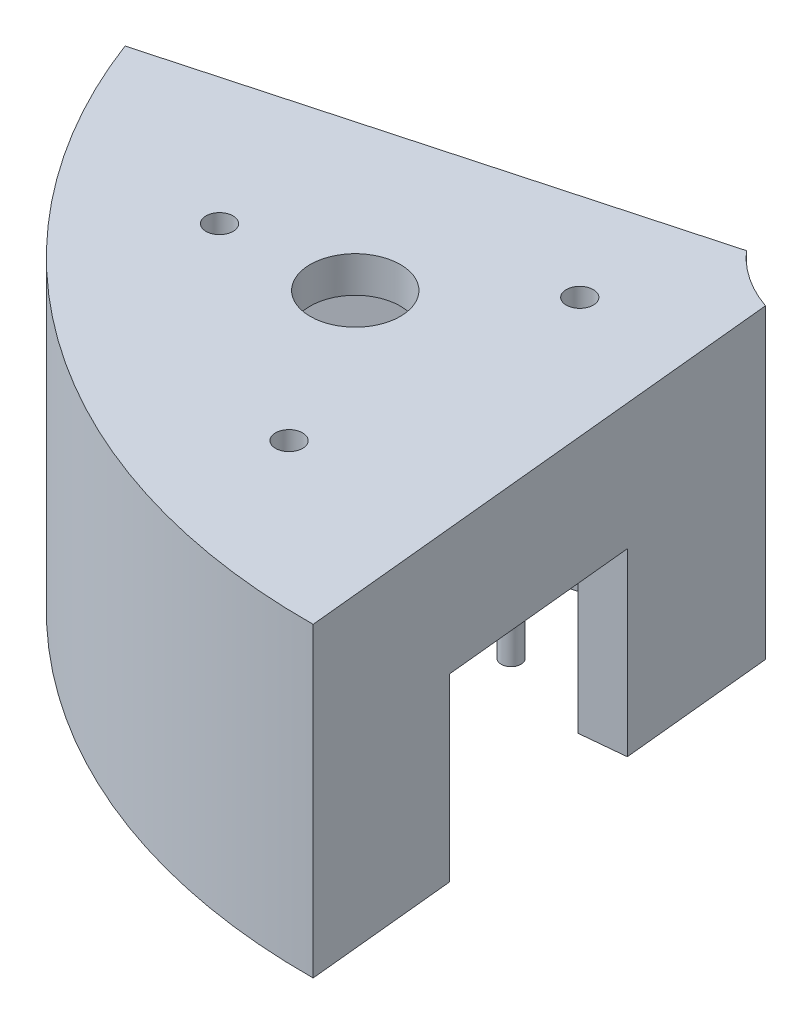
ISO-10303-21;
HEADER;
FILE_DESCRIPTION(('STEP AP214'),'2;1');
FILE_NAME('part.step','',(''),(''),'','','');
FILE_SCHEMA(('AUTOMOTIVE_DESIGN { 1 0 10303 214 1 1 1 1 }'));
ENDSEC;
DATA;
#1=APPLICATION_CONTEXT('core data for automotive mechanical design processes');
#2=APPLICATION_PROTOCOL_DEFINITION('international standard','automotive_design',2000,#1);
#3=PRODUCT_CONTEXT('',#1,'mechanical');
#4=PRODUCT('Part','Part','',(#3));
#5=PRODUCT_RELATED_PRODUCT_CATEGORY('part','',(#4));
#6=PRODUCT_DEFINITION_FORMATION('','',#4);
#7=PRODUCT_DEFINITION_CONTEXT('part definition',#1,'design');
#8=PRODUCT_DEFINITION('design','',#6,#7);
#9=PRODUCT_DEFINITION_SHAPE('','',#8);
#10=(LENGTH_UNIT() NAMED_UNIT(*) SI_UNIT(.MILLI.,.METRE.));
#11=(NAMED_UNIT(*) PLANE_ANGLE_UNIT() SI_UNIT($,.RADIAN.));
#12=(NAMED_UNIT(*) SI_UNIT($,.STERADIAN.) SOLID_ANGLE_UNIT());
#13=UNCERTAINTY_MEASURE_WITH_UNIT(LENGTH_MEASURE(1.E-05),#10,'distance_accuracy_value','');
#14=(GEOMETRIC_REPRESENTATION_CONTEXT(3) GLOBAL_UNCERTAINTY_ASSIGNED_CONTEXT((#13)) GLOBAL_UNIT_ASSIGNED_CONTEXT((#10,
#11,#12)) REPRESENTATION_CONTEXT('',''));
#15=CARTESIAN_POINT('',(0.,0.,0.));
#16=DIRECTION('',(0.,0.,1.));
#17=DIRECTION('',(1.,0.,0.));
#18=AXIS2_PLACEMENT_3D('',#15,#16,#17);
#19=CARTESIAN_POINT('',(-7.71564874168124,30.,0.68961613389634));
#20=DIRECTION('',(0.,-1.,0.));
#21=DIRECTION('',(0.,0.,-1.));
#22=AXIS2_PLACEMENT_3D('',#19,#20,#21);
#23=PLANE('',#22);
#24=CARTESIAN_POINT('',(-39.8044226076985,30.,40.1866372368154));
#25=DIRECTION('',(0.,-1.,0.));
#26=DIRECTION('',(0.,0.,-1.));
#27=AXIS2_PLACEMENT_3D('',#24,#25,#26);
#28=CIRCLE('',#27,5.);
#29=CARTESIAN_POINT('',(-39.8044226076985,30.,35.1866372368154));
#30=VERTEX_POINT('',#29);
#31=EDGE_CURVE('E320',#30,#30,#28,.T.);
#32=ORIENTED_EDGE('',*,*,#31,.F.);
#33=EDGE_LOOP('',(#32));
#34=FACE_BOUND('',#33,.T.);
#35=CARTESIAN_POINT('',(-53.760144922016,30.,41.2992084415757));
#36=DIRECTION('',(0.,-1.,0.));
#37=DIRECTION('',(0.,0.,-1.));
#38=AXIS2_PLACEMENT_3D('',#35,#36,#37);
#39=CIRCLE('',#38,1.5);
#40=CARTESIAN_POINT('',(-53.760144922016,30.,39.7992084415757));
#41=VERTEX_POINT('',#40);
#42=EDGE_CURVE('E311',#41,#41,#39,.T.);
#43=ORIENTED_EDGE('',*,*,#42,.F.);
#44=EDGE_LOOP('',(#43));
#45=FACE_BOUND('',#44,.T.);
#46=CARTESIAN_POINT('',(-29.0414322100276,30.,58.2987743731572));
#47=DIRECTION('',(0.,-1.,0.));
#48=DIRECTION('',(0.,0.,-1.));
#49=AXIS2_PLACEMENT_3D('',#46,#47,#48);
#50=CIRCLE('',#49,1.5);
#51=CARTESIAN_POINT('',(-29.0414322100276,30.,56.7987743731572));
#52=VERTEX_POINT('',#51);
#53=EDGE_CURVE('E316',#52,#52,#50,.T.);
#54=ORIENTED_EDGE('',*,*,#53,.F.);
#55=EDGE_LOOP('',(#54));
#56=FACE_BOUND('',#55,.T.);
#57=CARTESIAN_POINT('',(-26.6787326159637,30.,28.3919582499352));
#58=DIRECTION('',(0.,-1.,0.));
#59=DIRECTION('',(0.,0.,-1.));
#60=AXIS2_PLACEMENT_3D('',#57,#58,#59);
#61=CIRCLE('',#60,1.5);
#62=CARTESIAN_POINT('',(-26.6787326159637,30.,26.8919582499352));
#63=VERTEX_POINT('',#62);
#64=EDGE_CURVE('E310',#63,#63,#61,.T.);
#65=ORIENTED_EDGE('',*,*,#64,.F.);
#66=EDGE_LOOP('',(#65));
#67=FACE_BOUND('',#66,.T.);
#68=DIRECTION('',(-0.963914080377249,0.,0.266213533935604));
#69=VECTOR('',#68,1.);
#70=CARTESIAN_POINT('',(-35.1514498430067,30.,30.7432378051372));
#71=LINE('',#70,#69);
#72=CARTESIAN_POINT('',(-35.1514498430067,30.,30.7432378051372));
#73=VERTEX_POINT('',#72);
#74=CARTESIAN_POINT('',(-56.3576215387011,30.,36.5999526548119));
#75=VERTEX_POINT('',#74);
#76=EDGE_CURVE('E55',#73,#75,#71,.T.);
#77=ORIENTED_EDGE('',*,*,#76,.F.);
#78=DIRECTION('',(0.266213533935604,0.,0.963914080377249));
#79=VECTOR('',#78,1.);
#80=CARTESIAN_POINT('',(-37.0149445805559,30.,23.9958392424964));
#81=LINE('',#80,#79);
#82=CARTESIAN_POINT('',(-37.0149445805559,30.,23.9958392424964));
#83=VERTEX_POINT('',#82);
#84=EDGE_CURVE('E212',#83,#73,#81,.T.);
#85=ORIENTED_EDGE('',*,*,#84,.F.);
#86=DIRECTION('',(0.963914080377249,0.,-0.266213533935604));
#87=VECTOR('',#86,1.);
#88=CARTESIAN_POINT('',(-24.1918740905534,30.,20.4543670505839));
#89=LINE('',#88,#87);
#90=CARTESIAN_POINT('',(-24.1918740905534,30.,20.4543670505839));
#91=VERTEX_POINT('',#90);
#92=EDGE_CURVE('E343',#83,#91,#89,.T.);
#93=ORIENTED_EDGE('',*,*,#92,.T.);
#94=CARTESIAN_POINT('',(-12.1841150520235,30.,9.47882797219441));
#95=DIRECTION('',(0.,1.,0.));
#96=DIRECTION('',(0.,0.,-1.));
#97=AXIS2_PLACEMENT_3D('',#94,#95,#96);
#98=CIRCLE('',#97,16.2680280055283);
#99=CARTESIAN_POINT('',(-20.1104082102706,30.,23.685256515575));
#100=VERTEX_POINT('',#99);
#101=EDGE_CURVE('E348',#91,#100,#98,.T.);
#102=ORIENTED_EDGE('',*,*,#101,.T.);
#103=DIRECTION('',(0.0960885190155767,0.,0.995372792733151));
#104=VECTOR('',#103,1.);
#105=CARTESIAN_POINT('',(-15.6160084731713,30.,70.2423609834927));
#106=LINE('',#105,#104);
#107=CARTESIAN_POINT('',(-18.8830181197009,30.,36.3996860305656));
#108=VERTEX_POINT('',#107);
#109=EDGE_CURVE('E353',#100,#108,#106,.T.);
#110=ORIENTED_EDGE('',*,*,#109,.T.);
#111=DIRECTION('',(0.995372792733151,0.,-0.0960885190155766));
#112=VECTOR('',#111,1.);
#113=CARTESIAN_POINT('',(-18.8830181197009,30.,36.3996860305656));
#114=LINE('',#113,#112);
#115=CARTESIAN_POINT('',(-25.850627668833,30.,37.0723056636746));
#116=VERTEX_POINT('',#115);
#117=EDGE_CURVE('E214',#116,#108,#114,.T.);
#118=ORIENTED_EDGE('',*,*,#117,.F.);
#119=DIRECTION('',(-0.0960885190155769,0.,-0.995372792733151));
#120=VECTOR('',#119,1.);
#121=CARTESIAN_POINT('',(-25.850627668833,30.,37.0723056636746));
#122=LINE('',#121,#120);
#123=CARTESIAN_POINT('',(-23.7366802504903,30.,58.9705071038039));
#124=VERTEX_POINT('',#123);
#125=EDGE_CURVE('E229',#124,#116,#122,.T.);
#126=ORIENTED_EDGE('',*,*,#125,.F.);
#127=DIRECTION('',(-0.995372792733151,0.,0.0960885190155767));
#128=VECTOR('',#127,1.);
#129=CARTESIAN_POINT('',(-16.7690707013582,30.,58.2978874706949));
#130=LINE('',#129,#128);
#131=CARTESIAN_POINT('',(-16.7690707013582,30.,58.2978874706949));
#132=VERTEX_POINT('',#131);
#133=EDGE_CURVE('E218',#132,#124,#130,.T.);
#134=ORIENTED_EDGE('',*,*,#133,.F.);
#135=CARTESIAN_POINT('',(-15.6160084731713,30.,70.2423609834927));
#136=VERTEX_POINT('',#135);
#137=EDGE_CURVE('E352',#132,#136,#106,.T.);
#138=ORIENTED_EDGE('',*,*,#137,.T.);
#139=CARTESIAN_POINT('',(-7.71564874168124,30.,0.68961613389634));
#140=DIRECTION('',(0.,-1.,0.));
#141=DIRECTION('',(0.,0.,-1.));
#142=AXIS2_PLACEMENT_3D('',#139,#140,#141);
#143=CIRCLE('',#142,70.);
#144=CARTESIAN_POINT('',(-69.7881190193564,30.,33.0471258283574));
#145=VERTEX_POINT('',#144);
#146=EDGE_CURVE('E339',#136,#145,#143,.T.);
#147=ORIENTED_EDGE('',*,*,#146,.T.);
#148=CARTESIAN_POINT('',(-58.2211162762503,30.,29.8525540921712));
#149=VERTEX_POINT('',#148);
#150=EDGE_CURVE('E345',#145,#149,#89,.T.);
#151=ORIENTED_EDGE('',*,*,#150,.T.);
#152=DIRECTION('',(-0.266213533935604,0.,-0.963914080377249));
#153=VECTOR('',#152,1.);
#154=CARTESIAN_POINT('',(-58.2211162762503,30.,29.8525540921712));
#155=LINE('',#154,#153);
#156=EDGE_CURVE('E60',#75,#149,#155,.T.);
#157=ORIENTED_EDGE('',*,*,#156,.F.);
#158=EDGE_LOOP('',(#77,#85,#93,#102,#110,#118,#126,#134,#138,#147,#151,#157));
#159=FACE_BOUND('',#158,.T.);
#160=ADVANCED_FACE('F39',(#34,#45,#56,#67,#159),#23,.T.);
#161=CARTESIAN_POINT('',(-24.1918740905534,30.,20.4543670505839));
#162=DIRECTION('',(-0.266213533935604,0.,-0.963914080377249));
#163=DIRECTION('',(-0.963914080377249,0.,0.266213533935604));
#164=AXIS2_PLACEMENT_3D('',#161,#162,#163);
#165=PLANE('',#164);
#166=DIRECTION('',(0.,1.,0.));
#167=VECTOR('',#166,1.);
#168=CARTESIAN_POINT('',(-37.0149445805559,20.,23.9958392424964));
#169=LINE('',#168,#167);
#170=CARTESIAN_POINT('',(-37.0149445805559,20.,23.9958392424964));
#171=VERTEX_POINT('',#170);
#172=EDGE_CURVE('E777',#171,#83,#169,.T.);
#173=ORIENTED_EDGE('',*,*,#172,.F.);
#174=DIRECTION('',(0.,-1.,0.));
#175=VECTOR('',#174,1.);
#176=CARTESIAN_POINT('',(-37.0149445805559,30.,23.9958392424964));
#177=LINE('',#176,#175);
#178=CARTESIAN_POINT('',(-37.0149445805559,0.,23.9958392424964));
#179=VERTEX_POINT('',#178);
#180=EDGE_CURVE('E441',#171,#179,#177,.T.);
#181=ORIENTED_EDGE('',*,*,#180,.T.);
#182=DIRECTION('',(0.963914080377249,0.,-0.266213533935604));
#183=VECTOR('',#182,1.);
#184=CARTESIAN_POINT('',(-24.1918740905534,0.,20.4543670505839));
#185=LINE('',#184,#183);
#186=CARTESIAN_POINT('',(-24.1918740905534,0.,20.4543670505839));
#187=VERTEX_POINT('',#186);
#188=EDGE_CURVE('E361',#179,#187,#185,.T.);
#189=ORIENTED_EDGE('',*,*,#188,.T.);
#190=DIRECTION('',(0.,-1.,0.));
#191=VECTOR('',#190,1.);
#192=CARTESIAN_POINT('',(-24.1918740905534,30.,20.4543670505839));
#193=LINE('',#192,#191);
#194=EDGE_CURVE('E382',#91,#187,#193,.T.);
#195=ORIENTED_EDGE('',*,*,#194,.F.);
#196=ORIENTED_EDGE('',*,*,#92,.F.);
#197=EDGE_LOOP('',(#173,#181,#189,#195,#196));
#198=FACE_BOUND('',#197,.T.);
#199=ADVANCED_FACE('F534',(#198),#165,.F.);
#200=DIRECTION('',(0.,1.,0.));
#201=VECTOR('',#200,1.);
#202=CARTESIAN_POINT('',(-58.2211162762503,20.,29.8525540921712));
#203=LINE('',#202,#201);
#204=CARTESIAN_POINT('',(-58.2211162762503,20.,29.8525540921711));
#205=VERTEX_POINT('',#204);
#206=EDGE_CURVE('E220',#205,#149,#203,.T.);
#207=ORIENTED_EDGE('',*,*,#206,.T.);
#208=ORIENTED_EDGE('',*,*,#150,.F.);
#209=DIRECTION('',(0.,-1.,0.));
#210=VECTOR('',#209,1.);
#211=CARTESIAN_POINT('',(-69.7881190193564,30.,33.0471258283574));
#212=LINE('',#211,#210);
#213=CARTESIAN_POINT('',(-69.7881190193563,0.,33.0471258283574));
#214=VERTEX_POINT('',#213);
#215=EDGE_CURVE('E357',#145,#214,#212,.T.);
#216=ORIENTED_EDGE('',*,*,#215,.T.);
#217=CARTESIAN_POINT('',(-58.2211162762503,0.,29.8525540921712));
#218=VERTEX_POINT('',#217);
#219=EDGE_CURVE('E362',#214,#218,#185,.T.);
#220=ORIENTED_EDGE('',*,*,#219,.T.);
#221=DIRECTION('',(0.,1.,0.));
#222=VECTOR('',#221,1.);
#223=CARTESIAN_POINT('',(-58.2211162762503,30.,29.8525540921711));
#224=LINE('',#223,#222);
#225=EDGE_CURVE('E434',#218,#205,#224,.T.);
#226=ORIENTED_EDGE('',*,*,#225,.T.);
#227=EDGE_LOOP('',(#207,#208,#216,#220,#226));
#228=FACE_BOUND('',#227,.T.);
#229=ADVANCED_FACE('F540',(#228),#165,.F.);
#230=CARTESIAN_POINT('',(-15.6160084731713,30.,70.2423609834927));
#231=DIRECTION('',(0.995372792733151,0.,-0.0960885190155767));
#232=DIRECTION('',(-0.0960885190155767,0.,-0.995372792733151));
#233=AXIS2_PLACEMENT_3D('',#230,#231,#232);
#234=PLANE('',#233);
#235=DIRECTION('',(0.,1.,0.));
#236=VECTOR('',#235,1.);
#237=CARTESIAN_POINT('',(-18.8830181197009,20.,36.3996860305656));
#238=LINE('',#237,#236);
#239=CARTESIAN_POINT('',(-18.8830181197009,20.,36.3996860305656));
#240=VERTEX_POINT('',#239);
#241=EDGE_CURVE('E250',#240,#108,#238,.T.);
#242=ORIENTED_EDGE('',*,*,#241,.T.);
#243=ORIENTED_EDGE('',*,*,#109,.F.);
#244=DIRECTION('',(0.,-1.,0.));
#245=VECTOR('',#244,1.);
#246=CARTESIAN_POINT('',(-20.1104082102706,30.,23.685256515575));
#247=LINE('',#246,#245);
#248=CARTESIAN_POINT('',(-20.1104082102706,0.,23.685256515575));
#249=VERTEX_POINT('',#248);
#250=EDGE_CURVE('E379',#100,#249,#247,.T.);
#251=ORIENTED_EDGE('',*,*,#250,.T.);
#252=DIRECTION('',(0.0960885190155767,0.,0.995372792733151));
#253=VECTOR('',#252,1.);
#254=CARTESIAN_POINT('',(-15.6160084731713,0.,70.2423609834927));
#255=LINE('',#254,#253);
#256=CARTESIAN_POINT('',(-18.8830181197009,0.,36.3996860305656));
#257=VERTEX_POINT('',#256);
#258=EDGE_CURVE('E344',#249,#257,#255,.T.);
#259=ORIENTED_EDGE('',*,*,#258,.T.);
#260=DIRECTION('',(0.,-1.,0.));
#261=VECTOR('',#260,1.);
#262=CARTESIAN_POINT('',(-18.8830181197009,20.,36.3996860305656));
#263=LINE('',#262,#261);
#264=EDGE_CURVE('E280',#240,#257,#263,.T.);
#265=ORIENTED_EDGE('',*,*,#264,.F.);
#266=EDGE_LOOP('',(#242,#243,#251,#259,#265));
#267=FACE_BOUND('',#266,.T.);
#268=ADVANCED_FACE('F503',(#267),#234,.F.);
#269=DIRECTION('',(0.,1.,0.));
#270=VECTOR('',#269,1.);
#271=CARTESIAN_POINT('',(-16.7690707013582,20.,58.2978874706949));
#272=LINE('',#271,#270);
#273=CARTESIAN_POINT('',(-16.7690707013582,20.,58.2978874706949));
#274=VERTEX_POINT('',#273);
#275=EDGE_CURVE('E247',#274,#132,#272,.T.);
#276=ORIENTED_EDGE('',*,*,#275,.F.);
#277=DIRECTION('',(0.,1.,0.));
#278=VECTOR('',#277,1.);
#279=CARTESIAN_POINT('',(-16.7690707013582,20.,58.2978874706949));
#280=LINE('',#279,#278);
#281=CARTESIAN_POINT('',(-16.7690707013582,0.,58.2978874706949));
#282=VERTEX_POINT('',#281);
#283=EDGE_CURVE('E267',#282,#274,#280,.T.);
#284=ORIENTED_EDGE('',*,*,#283,.F.);
#285=CARTESIAN_POINT('',(-15.6160084731713,0.,70.2423609834927));
#286=VERTEX_POINT('',#285);
#287=EDGE_CURVE('E370',#282,#286,#255,.T.);
#288=ORIENTED_EDGE('',*,*,#287,.T.);
#289=DIRECTION('',(0.,-1.,0.));
#290=VECTOR('',#289,1.);
#291=CARTESIAN_POINT('',(-15.6160084731713,30.,70.2423609834927));
#292=LINE('',#291,#290);
#293=EDGE_CURVE('E374',#136,#286,#292,.T.);
#294=ORIENTED_EDGE('',*,*,#293,.F.);
#295=ORIENTED_EDGE('',*,*,#137,.F.);
#296=EDGE_LOOP('',(#276,#284,#288,#294,#295));
#297=FACE_BOUND('',#296,.T.);
#298=ADVANCED_FACE('F485',(#297),#234,.F.);
#299=CARTESIAN_POINT('',(-10.6933638711826,0.,4.70623319400284));
#300=DIRECTION('',(0.,1.,0.));
#301=DIRECTION('',(0.,0.,1.));
#302=AXIS2_PLACEMENT_3D('',#299,#300,#301);
#303=PLANE('',#302);
#304=ORIENTED_EDGE('',*,*,#188,.F.);
#305=DIRECTION('',(-0.263883253524935,0.,-0.964554627021764));
#306=VECTOR('',#305,1.);
#307=CARTESIAN_POINT('',(-36.7595451282694,0.,24.9293836040696));
#308=LINE('',#307,#306);
#309=CARTESIAN_POINT('',(-38.342844649419,0.,19.142055841939));
#310=VERTEX_POINT('',#309);
#311=EDGE_CURVE('E264',#179,#310,#308,.T.);
#312=ORIENTED_EDGE('',*,*,#311,.T.);
#313=DIRECTION('',(-0.964554627021764,0.,0.263883253524935));
#314=VECTOR('',#313,1.);
#315=CARTESIAN_POINT('',(-76.0815776763498,0.,29.4666340214087));
#316=LINE('',#315,#314);
#317=CARTESIAN_POINT('',(-21.9236668143079,0.,14.6500903835266));
#318=VERTEX_POINT('',#317);
#319=EDGE_CURVE('E408',#318,#310,#316,.T.);
#320=ORIENTED_EDGE('',*,*,#319,.F.);
#321=CARTESIAN_POINT('',(-10.6933638711826,0.,4.70623319400284));
#322=DIRECTION('',(0.,-1.,0.));
#323=DIRECTION('',(0.,0.,1.));
#324=AXIS2_PLACEMENT_3D('',#321,#322,#323);
#325=CIRCLE('',#324,15.0000000000004);
#326=CARTESIAN_POINT('',(-15.56015153904,0.,18.8947629908494));
#327=VERTEX_POINT('',#326);
#328=EDGE_CURVE('E378',#327,#318,#325,.T.);
#329=ORIENTED_EDGE('',*,*,#328,.F.);
#330=DIRECTION('',(-0.0985017011909147,0.,-0.995136882475218));
#331=VECTOR('',#330,1.);
#332=CARTESIAN_POINT('',(-10.0440562723488,0.,74.6224284094616));
#333=LINE('',#332,#331);
#334=CARTESIAN_POINT('',(-13.8753109599221,0.,35.9162659811531));
#335=VERTEX_POINT('',#334);
#336=EDGE_CURVE('E415',#335,#327,#333,.T.);
#337=ORIENTED_EDGE('',*,*,#336,.F.);
#338=DIRECTION('',(-0.995372792733151,0.,0.0960885190155767));
#339=VECTOR('',#338,1.);
#340=CARTESIAN_POINT('',(-12.910781363302,0.,35.8231549164721));
#341=LINE('',#340,#339);
#342=EDGE_CURVE('E288',#335,#257,#341,.T.);
#343=ORIENTED_EDGE('',*,*,#342,.T.);
#344=ORIENTED_EDGE('',*,*,#258,.F.);
#345=CARTESIAN_POINT('',(-12.1841150520235,0.,9.47882797219441));
#346=DIRECTION('',(0.,1.,0.));
#347=DIRECTION('',(0.,0.,-1.));
#348=AXIS2_PLACEMENT_3D('',#345,#346,#347);
#349=CIRCLE('',#348,16.2680280055283);
#350=EDGE_CURVE('E366',#187,#249,#349,.T.);
#351=ORIENTED_EDGE('',*,*,#350,.F.);
#352=EDGE_LOOP('',(#304,#312,#320,#329,#337,#343,#344,#351));
#353=FACE_BOUND('',#352,.T.);
#354=ADVANCED_FACE('F509',(#353),#303,.F.);
#355=CARTESIAN_POINT('',(-10.6933638711826,34.,4.70623319400284));
#356=DIRECTION('',(0.,-1.,0.));
#357=DIRECTION('',(0.,0.,-1.));
#358=AXIS2_PLACEMENT_3D('',#355,#356,#357);
#359=CYLINDRICAL_SURFACE('',#358,15.0000000000004);
#360=ORIENTED_EDGE('',*,*,#328,.T.);
#361=DIRECTION('',(0.,-1.,0.));
#362=VECTOR('',#361,1.);
#363=CARTESIAN_POINT('',(-21.9236668143079,34.,14.6500903835266));
#364=LINE('',#363,#362);
#365=CARTESIAN_POINT('',(-21.9236668143079,34.,14.6500903835266));
#366=VERTEX_POINT('',#365);
#367=EDGE_CURVE('E430',#366,#318,#364,.T.);
#368=ORIENTED_EDGE('',*,*,#367,.F.);
#369=CARTESIAN_POINT('',(-10.6933638711826,34.,4.70623319400284));
#370=DIRECTION('',(0.,-1.,0.));
#371=DIRECTION('',(0.,0.,1.));
#372=AXIS2_PLACEMENT_3D('',#369,#370,#371);
#373=CIRCLE('',#372,15.0000000000004);
#374=CARTESIAN_POINT('',(-15.56015153904,34.,18.8947629908494));
#375=VERTEX_POINT('',#374);
#376=EDGE_CURVE('E389',#375,#366,#373,.T.);
#377=ORIENTED_EDGE('',*,*,#376,.F.);
#378=DIRECTION('',(0.,-1.,0.));
#379=VECTOR('',#378,1.);
#380=CARTESIAN_POINT('',(-15.56015153904,34.,18.8947629908494));
#381=LINE('',#380,#379);
#382=EDGE_CURVE('E403',#375,#327,#381,.T.);
#383=ORIENTED_EDGE('',*,*,#382,.T.);
#384=EDGE_LOOP('',(#360,#368,#377,#383));
#385=FACE_BOUND('',#384,.T.);
#386=ADVANCED_FACE('F41',(#385),#359,.F.);
#387=CARTESIAN_POINT('',(-76.0815776763498,34.,29.4666340214087));
#388=DIRECTION('',(0.263883253524936,0.,0.964554627021764));
#389=DIRECTION('',(0.964554627021764,0.,-0.263883253524936));
#390=AXIS2_PLACEMENT_3D('',#387,#388,#389);
#391=PLANE('',#390);
#392=ORIENTED_EDGE('',*,*,#319,.T.);
#393=DIRECTION('',(0.,-1.,0.));
#394=VECTOR('',#393,1.);
#395=CARTESIAN_POINT('',(-38.342844649419,0.,19.142055841939));
#396=LINE('',#395,#394);
#397=CARTESIAN_POINT('',(-38.342844649419,20.,19.142055841939));
#398=VERTEX_POINT('',#397);
#399=EDGE_CURVE('E254',#398,#310,#396,.T.);
#400=ORIENTED_EDGE('',*,*,#399,.F.);
#401=DIRECTION('',(0.964554627021764,0.,-0.263883253524936));
#402=VECTOR('',#401,1.);
#403=CARTESIAN_POINT('',(-38.342844649419,20.,19.142055841939));
#404=LINE('',#403,#402);
#405=CARTESIAN_POINT('',(-59.5630464438978,20.,24.9474874194876));
#406=VERTEX_POINT('',#405);
#407=EDGE_CURVE('E261',#406,#398,#404,.T.);
#408=ORIENTED_EDGE('',*,*,#407,.F.);
#409=DIRECTION('',(0.,1.,0.));
#410=VECTOR('',#409,1.);
#411=CARTESIAN_POINT('',(-59.5630464438978,0.,24.9474874194876));
#412=LINE('',#411,#410);
#413=CARTESIAN_POINT('',(-59.5630464438978,0.,24.9474874194876));
#414=VERTEX_POINT('',#413);
#415=EDGE_CURVE('E257',#414,#406,#412,.T.);
#416=ORIENTED_EDGE('',*,*,#415,.F.);
#417=CARTESIAN_POINT('',(-76.0815776763498,0.,29.4666340214087));
#418=VERTEX_POINT('',#417);
#419=EDGE_CURVE('E407',#414,#418,#316,.T.);
#420=ORIENTED_EDGE('',*,*,#419,.T.);
#421=DIRECTION('',(0.,-1.,0.));
#422=VECTOR('',#421,1.);
#423=CARTESIAN_POINT('',(-76.0815776763498,34.,29.4666340214087));
#424=LINE('',#423,#422);
#425=CARTESIAN_POINT('',(-76.0815776763498,34.,29.4666340214087));
#426=VERTEX_POINT('',#425);
#427=EDGE_CURVE('E426',#426,#418,#424,.T.);
#428=ORIENTED_EDGE('',*,*,#427,.F.);
#429=DIRECTION('',(-0.964554627021764,0.,0.263883253524935));
#430=VECTOR('',#429,1.);
#431=CARTESIAN_POINT('',(-76.0815776763498,34.,29.4666340214087));
#432=LINE('',#431,#430);
#433=EDGE_CURVE('E393',#366,#426,#432,.T.);
#434=ORIENTED_EDGE('',*,*,#433,.F.);
#435=ORIENTED_EDGE('',*,*,#367,.T.);
#436=EDGE_LOOP('',(#392,#400,#408,#416,#420,#428,#434,#435));
#437=FACE_BOUND('',#436,.T.);
#438=ADVANCED_FACE('F519',(#437),#391,.F.);
#439=CARTESIAN_POINT('',(-10.6933638711826,34.,4.70623319400284));
#440=DIRECTION('',(0.,-1.,0.));
#441=DIRECTION('',(0.,0.,-1.));
#442=AXIS2_PLACEMENT_3D('',#439,#440,#441);
#443=CYLINDRICAL_SURFACE('',#442,69.9192101912204);
#444=CARTESIAN_POINT('',(-10.6933638711826,0.,4.70623319400284));
#445=DIRECTION('',(0.,1.,0.));
#446=DIRECTION('',(0.,0.,1.));
#447=AXIS2_PLACEMENT_3D('',#444,#445,#446);
#448=CIRCLE('',#447,69.9192101912204);
#449=CARTESIAN_POINT('',(-10.0440562723488,0.,74.6224284094616));
#450=VERTEX_POINT('',#449);
#451=EDGE_CURVE('E412',#418,#450,#448,.T.);
#452=ORIENTED_EDGE('',*,*,#451,.T.);
#453=DIRECTION('',(0.,-1.,0.));
#454=VECTOR('',#453,1.);
#455=CARTESIAN_POINT('',(-10.0440562723488,34.,74.6224284094616));
#456=LINE('',#455,#454);
#457=CARTESIAN_POINT('',(-10.0440562723488,34.,74.6224284094616));
#458=VERTEX_POINT('',#457);
#459=EDGE_CURVE('E422',#458,#450,#456,.T.);
#460=ORIENTED_EDGE('',*,*,#459,.F.);
#461=CARTESIAN_POINT('',(-10.6933638711826,34.,4.70623319400284));
#462=DIRECTION('',(0.,1.,0.));
#463=DIRECTION('',(0.,0.,1.));
#464=AXIS2_PLACEMENT_3D('',#461,#462,#463);
#465=CIRCLE('',#464,69.9192101912204);
#466=EDGE_CURVE('E397',#426,#458,#465,.T.);
#467=ORIENTED_EDGE('',*,*,#466,.F.);
#468=ORIENTED_EDGE('',*,*,#427,.T.);
#469=EDGE_LOOP('',(#452,#460,#467,#468));
#470=FACE_BOUND('',#469,.T.);
#471=ADVANCED_FACE('F525',(#470),#443,.T.);
#472=CARTESIAN_POINT('',(-10.0440562723488,34.,74.6224284094616));
#473=DIRECTION('',(-0.995136882475218,0.,0.0985017011909148));
#474=DIRECTION('',(0.0985017011909147,0.,0.995136882475218));
#475=AXIS2_PLACEMENT_3D('',#472,#473,#474);
#476=PLANE('',#475);
#477=CARTESIAN_POINT('',(-11.7082671635864,0.,57.8093417514192));
#478=VERTEX_POINT('',#477);
#479=EDGE_CURVE('E394',#450,#478,#333,.T.);
#480=ORIENTED_EDGE('',*,*,#479,.T.);
#481=DIRECTION('',(0.,1.,0.));
#482=VECTOR('',#481,1.);
#483=CARTESIAN_POINT('',(-11.7082671635864,34.,57.8093417514192));
#484=LINE('',#483,#482);
#485=CARTESIAN_POINT('',(-11.7082671635864,20.,57.8093417514192));
#486=VERTEX_POINT('',#485);
#487=EDGE_CURVE('E306',#478,#486,#484,.T.);
#488=ORIENTED_EDGE('',*,*,#487,.T.);
#489=DIRECTION('',(-0.0985017011909148,0.,-0.995136882475218));
#490=VECTOR('',#489,1.);
#491=CARTESIAN_POINT('',(-10.0440562723488,20.,74.6224284094616));
#492=LINE('',#491,#490);
#493=CARTESIAN_POINT('',(-13.8753109599221,20.,35.9162659811531));
#494=VERTEX_POINT('',#493);
#495=EDGE_CURVE('E287',#486,#494,#492,.T.);
#496=ORIENTED_EDGE('',*,*,#495,.T.);
#497=DIRECTION('',(0.,-1.,0.));
#498=VECTOR('',#497,1.);
#499=CARTESIAN_POINT('',(-13.8753109599221,34.,35.9162659811531));
#500=LINE('',#499,#498);
#501=EDGE_CURVE('E302',#494,#335,#500,.T.);
#502=ORIENTED_EDGE('',*,*,#501,.T.);
#503=ORIENTED_EDGE('',*,*,#336,.T.);
#504=ORIENTED_EDGE('',*,*,#382,.F.);
#505=DIRECTION('',(-0.0985017011909147,0.,-0.995136882475218));
#506=VECTOR('',#505,1.);
#507=CARTESIAN_POINT('',(-10.0440562723488,34.,74.6224284094616));
#508=LINE('',#507,#506);
#509=EDGE_CURVE('E400',#458,#375,#508,.T.);
#510=ORIENTED_EDGE('',*,*,#509,.F.);
#511=ORIENTED_EDGE('',*,*,#459,.T.);
#512=EDGE_LOOP('',(#480,#488,#496,#502,#503,#504,#510,#511));
#513=FACE_BOUND('',#512,.T.);
#514=ADVANCED_FACE('F473',(#513),#476,.F.);
#515=CARTESIAN_POINT('',(-10.6933638711826,34.,4.70623319400284));
#516=DIRECTION('',(0.,1.,0.));
#517=DIRECTION('',(0.,0.,1.));
#518=AXIS2_PLACEMENT_3D('',#515,#516,#517);
#519=PLANE('',#518);
#520=CARTESIAN_POINT('',(-53.760144922016,34.,41.2992084415757));
#521=DIRECTION('',(0.,1.,0.));
#522=DIRECTION('',(0.,0.,1.));
#523=AXIS2_PLACEMENT_3D('',#520,#521,#522);
#524=CIRCLE('',#523,1.5);
#525=CARTESIAN_POINT('',(-53.760144922016,34.,42.7992084415757));
#526=VERTEX_POINT('',#525);
#527=EDGE_CURVE('E334',#526,#526,#524,.T.);
#528=ORIENTED_EDGE('',*,*,#527,.F.);
#529=EDGE_LOOP('',(#528));
#530=FACE_BOUND('',#529,.T.);
#531=CARTESIAN_POINT('',(-29.0414322100276,34.,58.2987743731572));
#532=DIRECTION('',(0.,1.,0.));
#533=DIRECTION('',(0.,0.,1.));
#534=AXIS2_PLACEMENT_3D('',#531,#532,#533);
#535=CIRCLE('',#534,1.5);
#536=CARTESIAN_POINT('',(-29.0414322100276,34.,59.7987743731572));
#537=VERTEX_POINT('',#536);
#538=EDGE_CURVE('E330',#537,#537,#535,.T.);
#539=ORIENTED_EDGE('',*,*,#538,.F.);
#540=EDGE_LOOP('',(#539));
#541=FACE_BOUND('',#540,.T.);
#542=CARTESIAN_POINT('',(-39.8044226076985,34.,40.1866372368154));
#543=DIRECTION('',(0.,1.,0.));
#544=DIRECTION('',(0.,0.,1.));
#545=AXIS2_PLACEMENT_3D('',#542,#543,#544);
#546=CIRCLE('',#545,5.);
#547=CARTESIAN_POINT('',(-39.8044226076985,34.,45.1866372368153));
#548=VERTEX_POINT('',#547);
#549=EDGE_CURVE('E338',#548,#548,#546,.T.);
#550=ORIENTED_EDGE('',*,*,#549,.F.);
#551=EDGE_LOOP('',(#550));
#552=FACE_BOUND('',#551,.T.);
#553=CARTESIAN_POINT('',(-26.6787326159637,34.,28.3919582499352));
#554=DIRECTION('',(0.,1.,0.));
#555=DIRECTION('',(0.,0.,1.));
#556=AXIS2_PLACEMENT_3D('',#553,#554,#555);
#557=CIRCLE('',#556,1.5);
#558=CARTESIAN_POINT('',(-26.6787326159637,34.,29.8919582499352));
#559=VERTEX_POINT('',#558);
#560=EDGE_CURVE('E315',#559,#559,#557,.T.);
#561=ORIENTED_EDGE('',*,*,#560,.F.);
#562=EDGE_LOOP('',(#561));
#563=FACE_BOUND('',#562,.T.);
#564=ORIENTED_EDGE('',*,*,#376,.T.);
#565=ORIENTED_EDGE('',*,*,#433,.T.);
#566=ORIENTED_EDGE('',*,*,#466,.T.);
#567=ORIENTED_EDGE('',*,*,#509,.T.);
#568=EDGE_LOOP('',(#564,#565,#566,#567));
#569=FACE_BOUND('',#568,.T.);
#570=ADVANCED_FACE('F523',(#530,#541,#552,#563,#569),#519,.T.);
#571=ORIENTED_EDGE('',*,*,#419,.F.);
#572=DIRECTION('',(-0.263883253524935,0.,-0.964554627021764));
#573=VECTOR('',#572,1.);
#574=CARTESIAN_POINT('',(-57.9797469227482,0.,30.7348151816182));
#575=LINE('',#574,#573);
#576=EDGE_CURVE('E271',#218,#414,#575,.T.);
#577=ORIENTED_EDGE('',*,*,#576,.F.);
#578=ORIENTED_EDGE('',*,*,#219,.F.);
#579=CARTESIAN_POINT('',(-7.71564874168124,0.,0.68961613389634));
#580=DIRECTION('',(0.,-1.,0.));
#581=DIRECTION('',(0.,0.,-1.));
#582=AXIS2_PLACEMENT_3D('',#579,#580,#581);
#583=CIRCLE('',#582,70.);
#584=EDGE_CURVE('E358',#286,#214,#583,.T.);
#585=ORIENTED_EDGE('',*,*,#584,.F.);
#586=ORIENTED_EDGE('',*,*,#287,.F.);
#587=DIRECTION('',(-0.995372792733151,0.,0.0960885190155767));
#588=VECTOR('',#587,1.);
#589=CARTESIAN_POINT('',(-10.7968339449593,0.,57.7213563566014));
#590=LINE('',#589,#588);
#591=EDGE_CURVE('E284',#478,#282,#590,.T.);
#592=ORIENTED_EDGE('',*,*,#591,.F.);
#593=ORIENTED_EDGE('',*,*,#479,.F.);
#594=ORIENTED_EDGE('',*,*,#451,.F.);
#595=EDGE_LOOP('',(#571,#577,#578,#585,#586,#592,#593,#594));
#596=FACE_BOUND('',#595,.T.);
#597=ADVANCED_FACE('F480',(#596),#303,.F.);
#598=CARTESIAN_POINT('',(-7.71564874168124,30.,0.68961613389634));
#599=DIRECTION('',(0.,-1.,0.));
#600=DIRECTION('',(0.,0.,-1.));
#601=AXIS2_PLACEMENT_3D('',#598,#599,#600);
#602=CYLINDRICAL_SURFACE('',#601,70.);
#603=ORIENTED_EDGE('',*,*,#584,.T.);
#604=ORIENTED_EDGE('',*,*,#215,.F.);
#605=ORIENTED_EDGE('',*,*,#146,.F.);
#606=ORIENTED_EDGE('',*,*,#293,.T.);
#607=EDGE_LOOP('',(#603,#604,#605,#606));
#608=FACE_BOUND('',#607,.T.);
#609=ADVANCED_FACE('F553',(#608),#602,.F.);
#610=CARTESIAN_POINT('',(-12.1841150520235,30.,9.47882797219441));
#611=DIRECTION('',(0.,-1.,0.));
#612=DIRECTION('',(0.,0.,-1.));
#613=AXIS2_PLACEMENT_3D('',#610,#611,#612);
#614=CYLINDRICAL_SURFACE('',#613,16.2680280055283);
#615=ORIENTED_EDGE('',*,*,#350,.T.);
#616=ORIENTED_EDGE('',*,*,#250,.F.);
#617=ORIENTED_EDGE('',*,*,#101,.F.);
#618=ORIENTED_EDGE('',*,*,#194,.T.);
#619=EDGE_LOOP('',(#615,#616,#617,#618));
#620=FACE_BOUND('',#619,.T.);
#621=ADVANCED_FACE('F551',(#620),#614,.T.);
#622=CARTESIAN_POINT('',(-26.6787326159637,35.,28.3919582499352));
#623=DIRECTION('',(0.,-1.,0.));
#624=DIRECTION('',(0.,0.,-1.));
#625=AXIS2_PLACEMENT_3D('',#622,#623,#624);
#626=CYLINDRICAL_SURFACE('',#625,1.5);
#627=ORIENTED_EDGE('',*,*,#560,.T.);
#628=EDGE_LOOP('',(#627));
#629=FACE_BOUND('',#628,.T.);
#630=ORIENTED_EDGE('',*,*,#64,.T.);
#631=EDGE_LOOP('',(#630));
#632=FACE_BOUND('',#631,.T.);
#633=ADVANCED_FACE('F547',(#629,#632),#626,.F.);
#634=CARTESIAN_POINT('',(-29.0414322100276,35.,58.2987743731572));
#635=DIRECTION('',(0.,-1.,0.));
#636=DIRECTION('',(0.,0.,-1.));
#637=AXIS2_PLACEMENT_3D('',#634,#635,#636);
#638=CYLINDRICAL_SURFACE('',#637,1.5);
#639=ORIENTED_EDGE('',*,*,#538,.T.);
#640=EDGE_LOOP('',(#639));
#641=FACE_BOUND('',#640,.T.);
#642=ORIENTED_EDGE('',*,*,#53,.T.);
#643=EDGE_LOOP('',(#642));
#644=FACE_BOUND('',#643,.T.);
#645=ADVANCED_FACE('F649',(#641,#644),#638,.F.);
#646=CARTESIAN_POINT('',(-53.760144922016,35.,41.2992084415757));
#647=DIRECTION('',(0.,-1.,0.));
#648=DIRECTION('',(0.,0.,-1.));
#649=AXIS2_PLACEMENT_3D('',#646,#647,#648);
#650=CYLINDRICAL_SURFACE('',#649,1.5);
#651=ORIENTED_EDGE('',*,*,#527,.T.);
#652=EDGE_LOOP('',(#651));
#653=FACE_BOUND('',#652,.T.);
#654=ORIENTED_EDGE('',*,*,#42,.T.);
#655=EDGE_LOOP('',(#654));
#656=FACE_BOUND('',#655,.T.);
#657=ADVANCED_FACE('F638',(#653,#656),#650,.F.);
#658=CARTESIAN_POINT('',(-39.8044226076985,35.,40.1866372368154));
#659=DIRECTION('',(0.,-1.,0.));
#660=DIRECTION('',(0.,0.,-1.));
#661=AXIS2_PLACEMENT_3D('',#658,#659,#660);
#662=CYLINDRICAL_SURFACE('',#661,5.);
#663=ORIENTED_EDGE('',*,*,#549,.T.);
#664=EDGE_LOOP('',(#663));
#665=FACE_BOUND('',#664,.T.);
#666=ORIENTED_EDGE('',*,*,#31,.T.);
#667=EDGE_LOOP('',(#666));
#668=FACE_BOUND('',#667,.T.);
#669=ADVANCED_FACE('F633',(#665,#668),#662,.F.);
#670=CARTESIAN_POINT('',(-10.7968339449593,20.,57.7213563566014));
#671=DIRECTION('',(0.0960885190155767,0.,0.995372792733151));
#672=DIRECTION('',(0.995372792733151,0.,-0.0960885190155767));
#673=AXIS2_PLACEMENT_3D('',#670,#671,#672);
#674=PLANE('',#673);
#675=ORIENTED_EDGE('',*,*,#591,.T.);
#676=ORIENTED_EDGE('',*,*,#283,.T.);
#677=DIRECTION('',(-0.995372792733151,0.,0.0960885190155767));
#678=VECTOR('',#677,1.);
#679=CARTESIAN_POINT('',(-10.7968339449593,20.,57.7213563566014));
#680=LINE('',#679,#678);
#681=EDGE_CURVE('E283',#486,#274,#680,.T.);
#682=ORIENTED_EDGE('',*,*,#681,.F.);
#683=ORIENTED_EDGE('',*,*,#487,.F.);
#684=EDGE_LOOP('',(#675,#676,#682,#683));
#685=FACE_BOUND('',#684,.T.);
#686=ADVANCED_FACE('F469',(#685),#674,.F.);
#687=CARTESIAN_POINT('',(-12.910781363302,20.,35.8231549164721));
#688=DIRECTION('',(-0.0960885190155767,0.,-0.995372792733151));
#689=DIRECTION('',(-0.995372792733151,0.,0.0960885190155767));
#690=AXIS2_PLACEMENT_3D('',#687,#688,#689);
#691=PLANE('',#690);
#692=DIRECTION('',(-0.995372792733151,0.,0.0960885190155767));
#693=VECTOR('',#692,1.);
#694=CARTESIAN_POINT('',(-12.910781363302,20.,35.8231549164721));
#695=LINE('',#694,#693);
#696=EDGE_CURVE('E292',#494,#240,#695,.T.);
#697=ORIENTED_EDGE('',*,*,#696,.T.);
#698=ORIENTED_EDGE('',*,*,#264,.T.);
#699=ORIENTED_EDGE('',*,*,#342,.F.);
#700=ORIENTED_EDGE('',*,*,#501,.F.);
#701=EDGE_LOOP('',(#697,#698,#699,#700));
#702=FACE_BOUND('',#701,.T.);
#703=ADVANCED_FACE('F462',(#702),#691,.F.);
#704=CARTESIAN_POINT('',(-10.7968339449593,20.,57.7213563566014));
#705=DIRECTION('',(0.,1.,0.));
#706=DIRECTION('',(0.,0.,1.));
#707=AXIS2_PLACEMENT_3D('',#704,#705,#706);
#708=PLANE('',#707);
#709=CARTESIAN_POINT('',(-19.7591890167206,20.,42.9341121384358));
#710=DIRECTION('',(0.,1.,0.));
#711=DIRECTION('',(0.,0.,1.));
#712=AXIS2_PLACEMENT_3D('',#709,#710,#711);
#713=CIRCLE('',#712,1.09999999999999);
#714=CARTESIAN_POINT('',(-19.7591890167206,20.,44.0341121384358));
#715=VERTEX_POINT('',#714);
#716=EDGE_CURVE('E11',#715,#715,#713,.F.);
#717=ORIENTED_EDGE('',*,*,#716,.F.);
#718=EDGE_LOOP('',(#717));
#719=FACE_BOUND('',#718,.T.);
#720=CARTESIAN_POINT('',(-18.8463480860727,20.,52.3901536694007));
#721=DIRECTION('',(0.,1.,0.));
#722=DIRECTION('',(0.,0.,1.));
#723=AXIS2_PLACEMENT_3D('',#720,#721,#722);
#724=CIRCLE('',#723,1.09999999999999);
#725=CARTESIAN_POINT('',(-18.8463480860727,20.,53.4901536694007));
#726=VERTEX_POINT('',#725);
#727=EDGE_CURVE('E48',#726,#726,#724,.F.);
#728=ORIENTED_EDGE('',*,*,#727,.F.);
#729=EDGE_LOOP('',(#728));
#730=FACE_BOUND('',#729,.T.);
#731=ORIENTED_EDGE('',*,*,#681,.T.);
#732=DIRECTION('',(-0.995372792733151,0.,0.0960885190155767));
#733=VECTOR('',#732,1.);
#734=CARTESIAN_POINT('',(-16.7690707013582,20.,58.2978874706949));
#735=LINE('',#734,#733);
#736=CARTESIAN_POINT('',(-23.7366802504903,20.,58.9705071038039));
#737=VERTEX_POINT('',#736);
#738=EDGE_CURVE('E228',#274,#737,#735,.T.);
#739=ORIENTED_EDGE('',*,*,#738,.T.);
#740=DIRECTION('',(-0.0960885190155769,0.,-0.995372792733151));
#741=VECTOR('',#740,1.);
#742=CARTESIAN_POINT('',(-25.850627668833,20.,37.0723056636746));
#743=LINE('',#742,#741);
#744=CARTESIAN_POINT('',(-25.850627668833,20.,37.0723056636746));
#745=VERTEX_POINT('',#744);
#746=EDGE_CURVE('E232',#737,#745,#743,.T.);
#747=ORIENTED_EDGE('',*,*,#746,.T.);
#748=DIRECTION('',(0.995372792733151,0.,-0.0960885190155766));
#749=VECTOR('',#748,1.);
#750=CARTESIAN_POINT('',(-18.8830181197009,20.,36.3996860305656));
#751=LINE('',#750,#749);
#752=EDGE_CURVE('E224',#745,#240,#751,.T.);
#753=ORIENTED_EDGE('',*,*,#752,.T.);
#754=ORIENTED_EDGE('',*,*,#696,.F.);
#755=ORIENTED_EDGE('',*,*,#495,.F.);
#756=EDGE_LOOP('',(#731,#739,#747,#753,#754,#755));
#757=FACE_BOUND('',#756,.T.);
#758=ADVANCED_FACE('F458',(#719,#730,#757),#708,.F.);
#759=CARTESIAN_POINT('',(-36.7595451282694,0.,24.9293836040696));
#760=DIRECTION('',(0.964554627021764,0.,-0.263883253524935));
#761=DIRECTION('',(-0.263883253524935,0.,-0.964554627021764));
#762=AXIS2_PLACEMENT_3D('',#759,#760,#761);
#763=PLANE('',#762);
#764=DIRECTION('',(-0.263883253524935,0.,-0.964554627021764));
#765=VECTOR('',#764,1.);
#766=CARTESIAN_POINT('',(-36.7595451282694,20.,24.9293836040696));
#767=LINE('',#766,#765);
#768=EDGE_CURVE('E205',#171,#398,#767,.T.);
#769=ORIENTED_EDGE('',*,*,#768,.T.);
#770=ORIENTED_EDGE('',*,*,#399,.T.);
#771=ORIENTED_EDGE('',*,*,#311,.F.);
#772=ORIENTED_EDGE('',*,*,#180,.F.);
#773=EDGE_LOOP('',(#769,#770,#771,#772));
#774=FACE_BOUND('',#773,.T.);
#775=ADVANCED_FACE('F461',(#774),#763,.F.);
#776=CARTESIAN_POINT('',(-36.7595451282694,20.,24.9293836040696));
#777=DIRECTION('',(0.,1.,0.));
#778=DIRECTION('',(0.,0.,1.));
#779=AXIS2_PLACEMENT_3D('',#776,#777,#778);
#780=PLANE('',#779);
#781=CARTESIAN_POINT('',(-42.8040146030694,20.,27.1508183540203));
#782=DIRECTION('',(0.,1.,0.));
#783=DIRECTION('',(0.,0.,1.));
#784=AXIS2_PLACEMENT_3D('',#781,#782,#783);
#785=CIRCLE('',#784,1.1);
#786=CARTESIAN_POINT('',(-42.8040146030694,20.,28.2508183540203));
#787=VERTEX_POINT('',#786);
#788=EDGE_CURVE('E449',#787,#787,#785,.F.);
#789=ORIENTED_EDGE('',*,*,#788,.F.);
#790=EDGE_LOOP('',(#789));
#791=FACE_BOUND('',#790,.T.);
#792=CARTESIAN_POINT('',(-51.9611983666532,20.,29.6798469264086));
#793=DIRECTION('',(0.,1.,0.));
#794=DIRECTION('',(0.,0.,1.));
#795=AXIS2_PLACEMENT_3D('',#792,#793,#794);
#796=CIRCLE('',#795,1.1);
#797=CARTESIAN_POINT('',(-51.9611983666532,20.,30.7798469264085));
#798=VERTEX_POINT('',#797);
#799=EDGE_CURVE('E445',#798,#798,#796,.F.);
#800=ORIENTED_EDGE('',*,*,#799,.F.);
#801=EDGE_LOOP('',(#800));
#802=FACE_BOUND('',#801,.T.);
#803=DIRECTION('',(-0.263883253524935,0.,-0.964554627021764));
#804=VECTOR('',#803,1.);
#805=CARTESIAN_POINT('',(-57.9797469227482,20.,30.7348151816182));
#806=LINE('',#805,#804);
#807=EDGE_CURVE('E268',#205,#406,#806,.T.);
#808=ORIENTED_EDGE('',*,*,#807,.T.);
#809=ORIENTED_EDGE('',*,*,#407,.T.);
#810=ORIENTED_EDGE('',*,*,#768,.F.);
#811=DIRECTION('',(0.266213533935604,0.,0.963914080377249));
#812=VECTOR('',#811,1.);
#813=CARTESIAN_POINT('',(-37.0149445805559,20.,23.9958392424964));
#814=LINE('',#813,#812);
#815=CARTESIAN_POINT('',(-35.1514498430067,20.,30.7432378051372));
#816=VERTEX_POINT('',#815);
#817=EDGE_CURVE('E200',#171,#816,#814,.T.);
#818=ORIENTED_EDGE('',*,*,#817,.T.);
#819=DIRECTION('',(-0.963914080377249,0.,0.266213533935604));
#820=VECTOR('',#819,1.);
#821=CARTESIAN_POINT('',(-35.1514498430067,20.,30.7432378051372));
#822=LINE('',#821,#820);
#823=CARTESIAN_POINT('',(-56.3576215387011,20.,36.5999526548119));
#824=VERTEX_POINT('',#823);
#825=EDGE_CURVE('E187',#816,#824,#822,.T.);
#826=ORIENTED_EDGE('',*,*,#825,.T.);
#827=DIRECTION('',(-0.266213533935604,0.,-0.963914080377249));
#828=VECTOR('',#827,1.);
#829=CARTESIAN_POINT('',(-58.2211162762503,20.,29.8525540921712));
#830=LINE('',#829,#828);
#831=EDGE_CURVE('E199',#824,#205,#830,.T.);
#832=ORIENTED_EDGE('',*,*,#831,.T.);
#833=EDGE_LOOP('',(#808,#809,#810,#818,#826,#832));
#834=FACE_BOUND('',#833,.T.);
#835=ADVANCED_FACE('F203',(#791,#802,#834),#780,.F.);
#836=CARTESIAN_POINT('',(-57.9797469227482,0.,30.7348151816182));
#837=DIRECTION('',(-0.964554627021764,0.,0.263883253524935));
#838=DIRECTION('',(0.263883253524935,0.,0.964554627021764));
#839=AXIS2_PLACEMENT_3D('',#836,#837,#838);
#840=PLANE('',#839);
#841=ORIENTED_EDGE('',*,*,#576,.T.);
#842=ORIENTED_EDGE('',*,*,#415,.T.);
#843=ORIENTED_EDGE('',*,*,#807,.F.);
#844=ORIENTED_EDGE('',*,*,#225,.F.);
#845=EDGE_LOOP('',(#841,#842,#843,#844));
#846=FACE_BOUND('',#845,.T.);
#847=ADVANCED_FACE('F705',(#846),#840,.F.);
#848=CARTESIAN_POINT('',(-18.8830181197009,20.,36.3996860305656));
#849=DIRECTION('',(0.0960885190155766,0.,0.995372792733151));
#850=DIRECTION('',(0.995372792733151,0.,-0.0960885190155766));
#851=AXIS2_PLACEMENT_3D('',#848,#849,#850);
#852=PLANE('',#851);
#853=ORIENTED_EDGE('',*,*,#117,.T.);
#854=ORIENTED_EDGE('',*,*,#241,.F.);
#855=ORIENTED_EDGE('',*,*,#752,.F.);
#856=DIRECTION('',(0.,1.,0.));
#857=VECTOR('',#856,1.);
#858=CARTESIAN_POINT('',(-25.850627668833,20.,37.0723056636746));
#859=LINE('',#858,#857);
#860=EDGE_CURVE('E234',#745,#116,#859,.T.);
#861=ORIENTED_EDGE('',*,*,#860,.T.);
#862=EDGE_LOOP('',(#853,#854,#855,#861));
#863=FACE_BOUND('',#862,.T.);
#864=ADVANCED_FACE('F499',(#863),#852,.F.);
#865=CARTESIAN_POINT('',(-16.7690707013582,20.,58.2978874706949));
#866=DIRECTION('',(-0.0960885190155767,0.,-0.995372792733151));
#867=DIRECTION('',(-0.995372792733151,0.,0.0960885190155767));
#868=AXIS2_PLACEMENT_3D('',#865,#866,#867);
#869=PLANE('',#868);
#870=ORIENTED_EDGE('',*,*,#133,.T.);
#871=DIRECTION('',(0.,1.,0.));
#872=VECTOR('',#871,1.);
#873=CARTESIAN_POINT('',(-23.7366802504903,20.,58.9705071038039));
#874=LINE('',#873,#872);
#875=EDGE_CURVE('E243',#737,#124,#874,.T.);
#876=ORIENTED_EDGE('',*,*,#875,.F.);
#877=ORIENTED_EDGE('',*,*,#738,.F.);
#878=ORIENTED_EDGE('',*,*,#275,.T.);
#879=EDGE_LOOP('',(#870,#876,#877,#878));
#880=FACE_BOUND('',#879,.T.);
#881=ADVANCED_FACE('F490',(#880),#869,.F.);
#882=CARTESIAN_POINT('',(-25.850627668833,20.,37.0723056636746));
#883=DIRECTION('',(0.995372792733151,0.,-0.0960885190155769));
#884=DIRECTION('',(-0.0960885190155769,0.,-0.995372792733151));
#885=AXIS2_PLACEMENT_3D('',#882,#883,#884);
#886=PLANE('',#885);
#887=ORIENTED_EDGE('',*,*,#125,.T.);
#888=ORIENTED_EDGE('',*,*,#860,.F.);
#889=ORIENTED_EDGE('',*,*,#746,.F.);
#890=ORIENTED_EDGE('',*,*,#875,.T.);
#891=EDGE_LOOP('',(#887,#888,#889,#890));
#892=FACE_BOUND('',#891,.T.);
#893=ADVANCED_FACE('F495',(#892),#886,.F.);
#894=CARTESIAN_POINT('',(-37.0149445805559,20.,23.9958392424964));
#895=DIRECTION('',(-0.963914080377249,0.,0.266213533935604));
#896=DIRECTION('',(0.266213533935604,0.,0.963914080377249));
#897=AXIS2_PLACEMENT_3D('',#894,#895,#896);
#898=PLANE('',#897);
#899=ORIENTED_EDGE('',*,*,#84,.T.);
#900=DIRECTION('',(0.,1.,0.));
#901=VECTOR('',#900,1.);
#902=CARTESIAN_POINT('',(-35.1514498430067,20.,30.7432378051372));
#903=LINE('',#902,#901);
#904=EDGE_CURVE('E191',#816,#73,#903,.T.);
#905=ORIENTED_EDGE('',*,*,#904,.F.);
#906=ORIENTED_EDGE('',*,*,#817,.F.);
#907=ORIENTED_EDGE('',*,*,#172,.T.);
#908=EDGE_LOOP('',(#899,#905,#906,#907));
#909=FACE_BOUND('',#908,.T.);
#910=ADVANCED_FACE('F211',(#909),#898,.F.);
#911=CARTESIAN_POINT('',(-35.1514498430067,20.,30.7432378051372));
#912=DIRECTION('',(-0.266213533935604,0.,-0.963914080377249));
#913=DIRECTION('',(-0.963914080377249,0.,0.266213533935604));
#914=AXIS2_PLACEMENT_3D('',#911,#912,#913);
#915=PLANE('',#914);
#916=ORIENTED_EDGE('',*,*,#76,.T.);
#917=DIRECTION('',(0.,1.,0.));
#918=VECTOR('',#917,1.);
#919=CARTESIAN_POINT('',(-56.3576215387011,20.,36.5999526548119));
#920=LINE('',#919,#918);
#921=EDGE_CURVE('E194',#824,#75,#920,.T.);
#922=ORIENTED_EDGE('',*,*,#921,.F.);
#923=ORIENTED_EDGE('',*,*,#825,.F.);
#924=ORIENTED_EDGE('',*,*,#904,.T.);
#925=EDGE_LOOP('',(#916,#922,#923,#924));
#926=FACE_BOUND('',#925,.T.);
#927=ADVANCED_FACE('F189',(#926),#915,.F.);
#928=CARTESIAN_POINT('',(-58.2211162762503,20.,29.8525540921712));
#929=DIRECTION('',(0.963914080377249,0.,-0.266213533935604));
#930=DIRECTION('',(-0.266213533935604,0.,-0.963914080377249));
#931=AXIS2_PLACEMENT_3D('',#928,#929,#930);
#932=PLANE('',#931);
#933=ORIENTED_EDGE('',*,*,#156,.T.);
#934=ORIENTED_EDGE('',*,*,#206,.F.);
#935=ORIENTED_EDGE('',*,*,#831,.F.);
#936=ORIENTED_EDGE('',*,*,#921,.T.);
#937=EDGE_LOOP('',(#933,#934,#935,#936));
#938=FACE_BOUND('',#937,.T.);
#939=ADVANCED_FACE('F721',(#938),#932,.F.);
#940=CARTESIAN_POINT('',(-51.9611983666532,10.,29.6798469264086));
#941=DIRECTION('',(0.,1.,0.));
#942=DIRECTION('',(0.,0.,1.));
#943=AXIS2_PLACEMENT_3D('',#940,#941,#942);
#944=CYLINDRICAL_SURFACE('',#943,1.1);
#945=CARTESIAN_POINT('',(-51.9611983666532,10.,29.6798469264086));
#946=DIRECTION('',(0.,-1.,0.));
#947=DIRECTION('',(0.,0.,-1.));
#948=AXIS2_PLACEMENT_3D('',#945,#946,#947);
#949=CIRCLE('',#948,1.1);
#950=CARTESIAN_POINT('',(-51.9611983666532,10.,28.5798469264085));
#951=VERTEX_POINT('',#950);
#952=EDGE_CURVE('E771',#951,#951,#949,.T.);
#953=ORIENTED_EDGE('',*,*,#952,.F.);
#954=EDGE_LOOP('',(#953));
#955=FACE_BOUND('',#954,.T.);
#956=ORIENTED_EDGE('',*,*,#799,.T.);
#957=EDGE_LOOP('',(#956));
#958=FACE_BOUND('',#957,.T.);
#959=ADVANCED_FACE('F724',(#955,#958),#944,.T.);
#960=CARTESIAN_POINT('',(-51.9611983666532,10.,29.6798469264086));
#961=DIRECTION('',(0.,-1.,0.));
#962=DIRECTION('',(0.,0.,-1.));
#963=AXIS2_PLACEMENT_3D('',#960,#961,#962);
#964=PLANE('',#963);
#965=ORIENTED_EDGE('',*,*,#952,.T.);
#966=EDGE_LOOP('',(#965));
#967=FACE_BOUND('',#966,.T.);
#968=ADVANCED_FACE('F728',(#967),#964,.T.);
#969=CARTESIAN_POINT('',(-42.8040146030694,10.,27.1508183540203));
#970=DIRECTION('',(0.,1.,0.));
#971=DIRECTION('',(0.,0.,1.));
#972=AXIS2_PLACEMENT_3D('',#969,#970,#971);
#973=CYLINDRICAL_SURFACE('',#972,1.1);
#974=CARTESIAN_POINT('',(-42.8040146030694,10.,27.1508183540203));
#975=DIRECTION('',(0.,-1.,0.));
#976=DIRECTION('',(0.,0.,-1.));
#977=AXIS2_PLACEMENT_3D('',#974,#975,#976);
#978=CIRCLE('',#977,1.1);
#979=CARTESIAN_POINT('',(-42.8040146030694,10.,26.0508183540203));
#980=VERTEX_POINT('',#979);
#981=EDGE_CURVE('E765',#980,#980,#978,.T.);
#982=ORIENTED_EDGE('',*,*,#981,.F.);
#983=EDGE_LOOP('',(#982));
#984=FACE_BOUND('',#983,.T.);
#985=ORIENTED_EDGE('',*,*,#788,.T.);
#986=EDGE_LOOP('',(#985));
#987=FACE_BOUND('',#986,.T.);
#988=ADVANCED_FACE('F732',(#984,#987),#973,.T.);
#989=CARTESIAN_POINT('',(-42.8040146030694,10.,27.1508183540203));
#990=DIRECTION('',(0.,-1.,0.));
#991=DIRECTION('',(0.,0.,-1.));
#992=AXIS2_PLACEMENT_3D('',#989,#990,#991);
#993=PLANE('',#992);
#994=ORIENTED_EDGE('',*,*,#981,.T.);
#995=EDGE_LOOP('',(#994));
#996=FACE_BOUND('',#995,.T.);
#997=ADVANCED_FACE('F736',(#996),#993,.T.);
#998=CARTESIAN_POINT('',(-18.8463480860727,10.,52.3901536694007));
#999=DIRECTION('',(0.,1.,0.));
#1000=DIRECTION('',(0.,0.,1.));
#1001=AXIS2_PLACEMENT_3D('',#998,#999,#1000);
#1002=CYLINDRICAL_SURFACE('',#1001,1.09999999999999);
#1003=CARTESIAN_POINT('',(-18.8463480860727,10.,52.3901536694007));
#1004=DIRECTION('',(0.,-1.,0.));
#1005=DIRECTION('',(0.,0.,-1.));
#1006=AXIS2_PLACEMENT_3D('',#1003,#1004,#1005);
#1007=CIRCLE('',#1006,1.09999999999999);
#1008=CARTESIAN_POINT('',(-18.8463480860727,10.,51.2901536694007));
#1009=VERTEX_POINT('',#1008);
#1010=EDGE_CURVE('E761',#1009,#1009,#1007,.T.);
#1011=ORIENTED_EDGE('',*,*,#1010,.F.);
#1012=EDGE_LOOP('',(#1011));
#1013=FACE_BOUND('',#1012,.T.);
#1014=ORIENTED_EDGE('',*,*,#727,.T.);
#1015=EDGE_LOOP('',(#1014));
#1016=FACE_BOUND('',#1015,.T.);
#1017=ADVANCED_FACE('F456',(#1013,#1016),#1002,.T.);
#1018=CARTESIAN_POINT('',(-18.8463480860727,10.,52.3901536694007));
#1019=DIRECTION('',(0.,-1.,0.));
#1020=DIRECTION('',(0.,0.,-1.));
#1021=AXIS2_PLACEMENT_3D('',#1018,#1019,#1020);
#1022=PLANE('',#1021);
#1023=ORIENTED_EDGE('',*,*,#1010,.T.);
#1024=EDGE_LOOP('',(#1023));
#1025=FACE_BOUND('',#1024,.T.);
#1026=ADVANCED_FACE('F743',(#1025),#1022,.T.);
#1027=CARTESIAN_POINT('',(-19.7591890167206,10.,42.9341121384358));
#1028=DIRECTION('',(0.,1.,0.));
#1029=DIRECTION('',(0.,0.,1.));
#1030=AXIS2_PLACEMENT_3D('',#1027,#1028,#1029);
#1031=CYLINDRICAL_SURFACE('',#1030,1.09999999999999);
#1032=CARTESIAN_POINT('',(-19.7591890167206,10.,42.9341121384358));
#1033=DIRECTION('',(0.,-1.,0.));
#1034=DIRECTION('',(0.,0.,-1.));
#1035=AXIS2_PLACEMENT_3D('',#1032,#1033,#1034);
#1036=CIRCLE('',#1035,1.09999999999999);
#1037=CARTESIAN_POINT('',(-19.7591890167206,10.,41.8341121384358));
#1038=VERTEX_POINT('',#1037);
#1039=EDGE_CURVE('E759',#1038,#1038,#1036,.T.);
#1040=ORIENTED_EDGE('',*,*,#1039,.F.);
#1041=EDGE_LOOP('',(#1040));
#1042=FACE_BOUND('',#1041,.T.);
#1043=ORIENTED_EDGE('',*,*,#716,.T.);
#1044=EDGE_LOOP('',(#1043));
#1045=FACE_BOUND('',#1044,.T.);
#1046=ADVANCED_FACE('F747',(#1042,#1045),#1031,.T.);
#1047=CARTESIAN_POINT('',(-19.7591890167206,10.,42.9341121384358));
#1048=DIRECTION('',(0.,-1.,0.));
#1049=DIRECTION('',(0.,0.,-1.));
#1050=AXIS2_PLACEMENT_3D('',#1047,#1048,#1049);
#1051=PLANE('',#1050);
#1052=ORIENTED_EDGE('',*,*,#1039,.T.);
#1053=EDGE_LOOP('',(#1052));
#1054=FACE_BOUND('',#1053,.T.);
#1055=ADVANCED_FACE('F751',(#1054),#1051,.T.);
#1056=CLOSED_SHELL('',(#160,#199,#229,#268,#298,#354,#386,#438,#471,#514,#570,#597,#609,#621,
#633,#645,#657,#669,#686,#703,#758,#775,#835,#847,#864,#881,#893,#910,#927,#939,#959,#968,#988,
#997,#1017,#1026,#1046,#1055));
#1057=MANIFOLD_SOLID_BREP('B2',#1056);
#1058=ADVANCED_BREP_SHAPE_REPRESENTATION('',(#18,#1057),#14);
#1059=SHAPE_DEFINITION_REPRESENTATION(#9,#1058);
ENDSEC;
END-ISO-10303-21;
